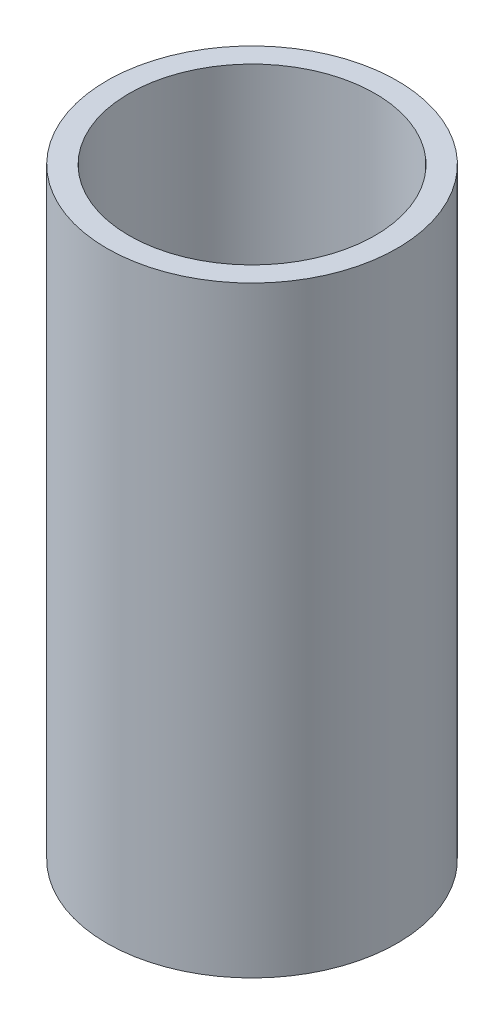
ISO-10303-21;
HEADER;
FILE_DESCRIPTION(('STEP AP214'),'2;1');
FILE_NAME('part.step','',(''),(''),'','','');
FILE_SCHEMA(('AUTOMOTIVE_DESIGN { 1 0 10303 214 1 1 1 1 }'));
ENDSEC;
DATA;
#1=APPLICATION_CONTEXT('core data for automotive mechanical design processes');
#2=APPLICATION_PROTOCOL_DEFINITION('international standard','automotive_design',2000,#1);
#3=PRODUCT_CONTEXT('',#1,'mechanical');
#4=PRODUCT('Part','Part','',(#3));
#5=PRODUCT_RELATED_PRODUCT_CATEGORY('part','',(#4));
#6=PRODUCT_DEFINITION_FORMATION('','',#4);
#7=PRODUCT_DEFINITION_CONTEXT('part definition',#1,'design');
#8=PRODUCT_DEFINITION('design','',#6,#7);
#9=PRODUCT_DEFINITION_SHAPE('','',#8);
#10=(LENGTH_UNIT() NAMED_UNIT(*) SI_UNIT(.MILLI.,.METRE.));
#11=(NAMED_UNIT(*) PLANE_ANGLE_UNIT() SI_UNIT($,.RADIAN.));
#12=(NAMED_UNIT(*) SI_UNIT($,.STERADIAN.) SOLID_ANGLE_UNIT());
#13=UNCERTAINTY_MEASURE_WITH_UNIT(LENGTH_MEASURE(1.E-05),#10,'distance_accuracy_value','');
#14=(GEOMETRIC_REPRESENTATION_CONTEXT(3) GLOBAL_UNCERTAINTY_ASSIGNED_CONTEXT((#13)) GLOBAL_UNIT_ASSIGNED_CONTEXT((#10,
#11,#12)) REPRESENTATION_CONTEXT('',''));
#15=CARTESIAN_POINT('',(0.,0.,0.));
#16=DIRECTION('',(0.,0.,1.));
#17=DIRECTION('',(1.,0.,0.));
#18=AXIS2_PLACEMENT_3D('',#15,#16,#17);
#19=CARTESIAN_POINT('',(0.,100.,0.));
#20=DIRECTION('',(0.,1.,0.));
#21=DIRECTION('',(0.,0.,1.));
#22=AXIS2_PLACEMENT_3D('',#19,#20,#21);
#23=PLANE('',#22);
#24=CARTESIAN_POINT('',(0.,100.,0.));
#25=DIRECTION('',(0.,1.,0.));
#26=DIRECTION('',(0.,0.,1.));
#27=AXIS2_PLACEMENT_3D('',#24,#25,#26);
#28=CIRCLE('',#27,24.13);
#29=CARTESIAN_POINT('',(0.,100.,24.13));
#30=VERTEX_POINT('',#29);
#31=EDGE_CURVE('E10',#30,#30,#28,.T.);
#32=ORIENTED_EDGE('',*,*,#31,.T.);
#33=EDGE_LOOP('',(#32));
#34=FACE_BOUND('',#33,.T.);
#35=CARTESIAN_POINT('',(0.,100.,0.));
#36=DIRECTION('',(0.,1.,0.));
#37=DIRECTION('',(0.,0.,1.));
#38=AXIS2_PLACEMENT_3D('',#35,#36,#37);
#39=CIRCLE('',#38,20.445);
#40=CARTESIAN_POINT('',(0.,100.,20.445));
#41=VERTEX_POINT('',#40);
#42=EDGE_CURVE('E42',#41,#41,#39,.T.);
#43=ORIENTED_EDGE('',*,*,#42,.F.);
#44=EDGE_LOOP('',(#43));
#45=FACE_BOUND('',#44,.T.);
#46=ADVANCED_FACE('F31',(#34,#45),#23,.T.);
#47=CARTESIAN_POINT('',(0.,0.,0.));
#48=DIRECTION('',(0.,1.,0.));
#49=DIRECTION('',(0.,0.,1.));
#50=AXIS2_PLACEMENT_3D('',#47,#48,#49);
#51=PLANE('',#50);
#52=CARTESIAN_POINT('',(0.,0.,0.));
#53=DIRECTION('',(0.,1.,0.));
#54=DIRECTION('',(0.,0.,1.));
#55=AXIS2_PLACEMENT_3D('',#52,#53,#54);
#56=CIRCLE('',#55,24.13);
#57=CARTESIAN_POINT('',(0.,0.,24.13));
#58=VERTEX_POINT('',#57);
#59=EDGE_CURVE('E35',#58,#58,#56,.T.);
#60=ORIENTED_EDGE('',*,*,#59,.F.);
#61=EDGE_LOOP('',(#60));
#62=FACE_BOUND('',#61,.T.);
#63=CARTESIAN_POINT('',(0.,0.,0.));
#64=DIRECTION('',(0.,1.,0.));
#65=DIRECTION('',(0.,0.,1.));
#66=AXIS2_PLACEMENT_3D('',#63,#64,#65);
#67=CIRCLE('',#66,20.445);
#68=CARTESIAN_POINT('',(0.,0.,20.445));
#69=VERTEX_POINT('',#68);
#70=EDGE_CURVE('E44',#69,#69,#67,.T.);
#71=ORIENTED_EDGE('',*,*,#70,.T.);
#72=EDGE_LOOP('',(#71));
#73=FACE_BOUND('',#72,.T.);
#74=ADVANCED_FACE('F54',(#62,#73),#51,.F.);
#75=CARTESIAN_POINT('',(0.,100.,0.));
#76=DIRECTION('',(0.,-1.,0.));
#77=DIRECTION('',(0.,0.,-1.));
#78=AXIS2_PLACEMENT_3D('',#75,#76,#77);
#79=CYLINDRICAL_SURFACE('',#78,24.13);
#80=ORIENTED_EDGE('',*,*,#31,.F.);
#81=EDGE_LOOP('',(#80));
#82=FACE_BOUND('',#81,.T.);
#83=ORIENTED_EDGE('',*,*,#59,.T.);
#84=EDGE_LOOP('',(#83));
#85=FACE_BOUND('',#84,.T.);
#86=ADVANCED_FACE('F33',(#82,#85),#79,.T.);
#87=CARTESIAN_POINT('',(0.,100.,0.));
#88=DIRECTION('',(0.,-1.,0.));
#89=DIRECTION('',(0.,0.,-1.));
#90=AXIS2_PLACEMENT_3D('',#87,#88,#89);
#91=CYLINDRICAL_SURFACE('',#90,20.445);
#92=ORIENTED_EDGE('',*,*,#42,.T.);
#93=EDGE_LOOP('',(#92));
#94=FACE_BOUND('',#93,.T.);
#95=ORIENTED_EDGE('',*,*,#70,.F.);
#96=EDGE_LOOP('',(#95));
#97=FACE_BOUND('',#96,.T.);
#98=ADVANCED_FACE('F50',(#94,#97),#91,.F.);
#99=CLOSED_SHELL('',(#46,#74,#86,#98));
#100=MANIFOLD_SOLID_BREP('B2',#99);
#101=ADVANCED_BREP_SHAPE_REPRESENTATION('',(#18,#100),#14);
#102=SHAPE_DEFINITION_REPRESENTATION(#9,#101);
ENDSEC;
END-ISO-10303-21;
